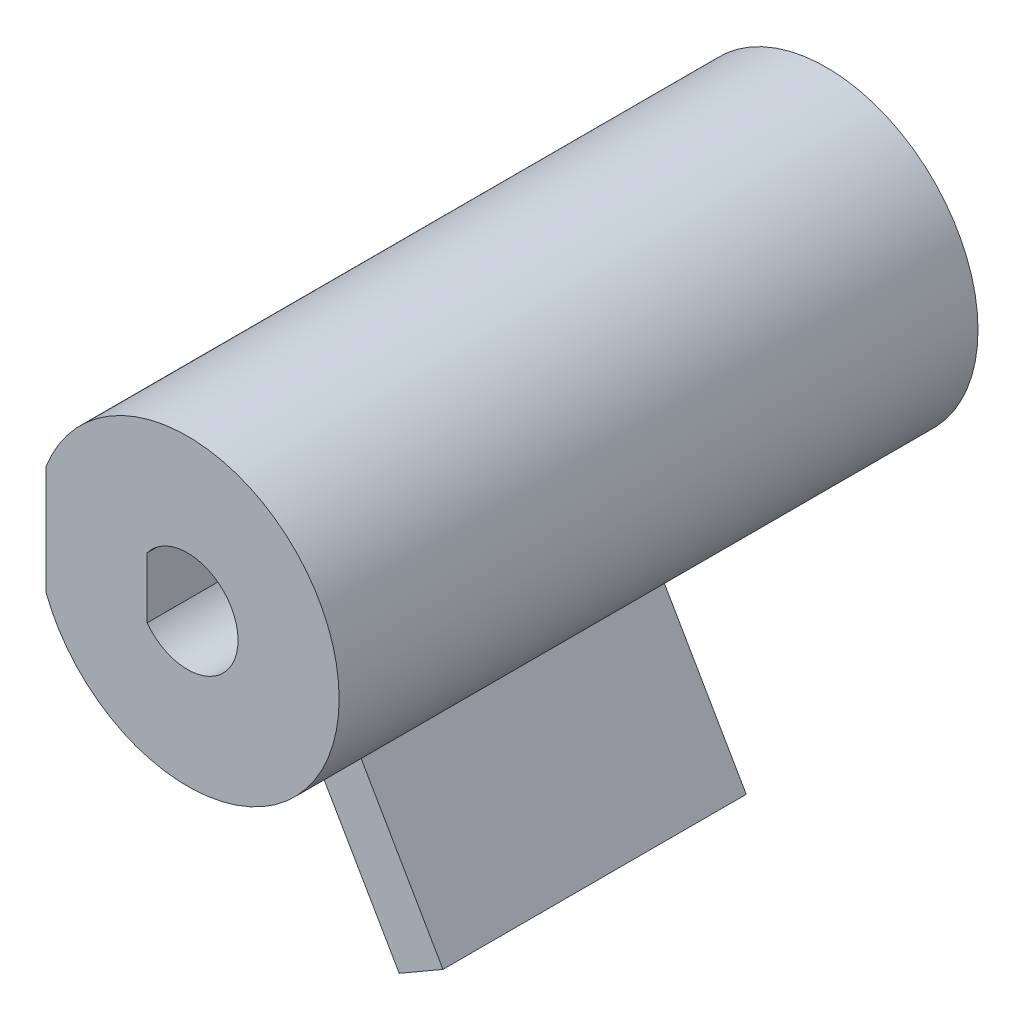
ISO-10303-21;
HEADER;
FILE_DESCRIPTION(('STEP AP214'),'2;1');
FILE_NAME('part.step','',(''),(''),'','','');
FILE_SCHEMA(('AUTOMOTIVE_DESIGN { 1 0 10303 214 1 1 1 1 }'));
ENDSEC;
DATA;
#1=APPLICATION_CONTEXT('core data for automotive mechanical design processes');
#2=APPLICATION_PROTOCOL_DEFINITION('international standard','automotive_design',2000,#1);
#3=PRODUCT_CONTEXT('',#1,'mechanical');
#4=PRODUCT('Part','Part','',(#3));
#5=PRODUCT_RELATED_PRODUCT_CATEGORY('part','',(#4));
#6=PRODUCT_DEFINITION_FORMATION('','',#4);
#7=PRODUCT_DEFINITION_CONTEXT('part definition',#1,'design');
#8=PRODUCT_DEFINITION('design','',#6,#7);
#9=PRODUCT_DEFINITION_SHAPE('','',#8);
#10=(LENGTH_UNIT() NAMED_UNIT(*) SI_UNIT(.MILLI.,.METRE.));
#11=(NAMED_UNIT(*) PLANE_ANGLE_UNIT() SI_UNIT($,.RADIAN.));
#12=(NAMED_UNIT(*) SI_UNIT($,.STERADIAN.) SOLID_ANGLE_UNIT());
#13=UNCERTAINTY_MEASURE_WITH_UNIT(LENGTH_MEASURE(1.E-05),#10,'distance_accuracy_value','');
#14=(GEOMETRIC_REPRESENTATION_CONTEXT(3) GLOBAL_UNCERTAINTY_ASSIGNED_CONTEXT((#13)) GLOBAL_UNIT_ASSIGNED_CONTEXT((#10,
#11,#12)) REPRESENTATION_CONTEXT('',''));
#15=CARTESIAN_POINT('',(0.,0.,0.));
#16=DIRECTION('',(0.,0.,1.));
#17=DIRECTION('',(1.,0.,0.));
#18=AXIS2_PLACEMENT_3D('',#15,#16,#17);
#19=CARTESIAN_POINT('',(0.,0.,63.2));
#20=DIRECTION('',(0.,0.,-1.));
#21=DIRECTION('',(-1.,0.,0.));
#22=AXIS2_PLACEMENT_3D('',#19,#20,#21);
#23=CYLINDRICAL_SURFACE('',#22,15.);
#24=CARTESIAN_POINT('',(0.,0.,0.));
#25=DIRECTION('',(0.,0.,1.));
#26=DIRECTION('',(1.,0.,0.));
#27=AXIS2_PLACEMENT_3D('',#24,#25,#26);
#28=CIRCLE('',#27,15.);
#29=CARTESIAN_POINT('',(-14.,-5.3851648071345,0.));
#30=VERTEX_POINT('',#29);
#31=CARTESIAN_POINT('',(-14.,5.3851648071345,0.));
#32=VERTEX_POINT('',#31);
#33=EDGE_CURVE('E164',#30,#32,#28,.T.);
#34=ORIENTED_EDGE('',*,*,#33,.T.);
#35=DIRECTION('',(0.,0.,-1.));
#36=VECTOR('',#35,1.);
#37=CARTESIAN_POINT('',(-14.,5.3851648071345,63.2));
#38=LINE('',#37,#36);
#39=CARTESIAN_POINT('',(-14.,5.3851648071345,63.2));
#40=VERTEX_POINT('',#39);
#41=EDGE_CURVE('E57',#40,#32,#38,.T.);
#42=ORIENTED_EDGE('',*,*,#41,.F.);
#43=CARTESIAN_POINT('',(0.,0.,63.2));
#44=DIRECTION('',(0.,0.,1.));
#45=DIRECTION('',(1.,0.,0.));
#46=AXIS2_PLACEMENT_3D('',#43,#44,#45);
#47=CIRCLE('',#46,15.);
#48=CARTESIAN_POINT('',(-14.,-5.3851648071345,63.2));
#49=VERTEX_POINT('',#48);
#50=EDGE_CURVE('E165',#49,#40,#47,.T.);
#51=ORIENTED_EDGE('',*,*,#50,.F.);
#52=DIRECTION('',(0.,0.,-1.));
#53=VECTOR('',#52,1.);
#54=CARTESIAN_POINT('',(-14.,-5.3851648071345,63.2));
#55=LINE('',#54,#53);
#56=EDGE_CURVE('E171',#49,#30,#55,.T.);
#57=ORIENTED_EDGE('',*,*,#56,.T.);
#58=EDGE_LOOP('',(#34,#42,#51,#57));
#59=FACE_BOUND('',#58,.T.);
#60=CARTESIAN_POINT('',(0.,0.,46.6));
#61=DIRECTION('',(0.,0.,-1.));
#62=DIRECTION('',(-1.,0.,0.));
#63=AXIS2_PLACEMENT_3D('',#60,#61,#62);
#64=CIRCLE('',#63,15.);
#65=CARTESIAN_POINT('',(-2.83100951711182,-14.7304237927502,46.6));
#66=VERTEX_POINT('',#65);
#67=CARTESIAN_POINT('',(-11.6636895265445,-9.43177324941475,46.6));
#68=VERTEX_POINT('',#67);
#69=EDGE_CURVE('E130',#66,#68,#64,.T.);
#70=ORIENTED_EDGE('',*,*,#69,.F.);
#71=DIRECTION('',(0.,0.,-1.));
#72=VECTOR('',#71,1.);
#73=CARTESIAN_POINT('',(-2.83100951711182,-14.7304237927502,63.2));
#74=LINE('',#73,#72);
#75=CARTESIAN_POINT('',(-2.83100951711182,-14.7304237927502,16.6));
#76=VERTEX_POINT('',#75);
#77=EDGE_CURVE('E12',#76,#66,#74,.F.);
#78=ORIENTED_EDGE('',*,*,#77,.F.);
#79=CARTESIAN_POINT('',(0.,0.,16.6));
#80=DIRECTION('',(0.,0.,-1.));
#81=DIRECTION('',(-1.,0.,0.));
#82=AXIS2_PLACEMENT_3D('',#79,#80,#81);
#83=CIRCLE('',#82,15.);
#84=CARTESIAN_POINT('',(-11.6636895265445,-9.43177324941475,16.6));
#85=VERTEX_POINT('',#84);
#86=EDGE_CURVE('E121',#76,#85,#83,.T.);
#87=ORIENTED_EDGE('',*,*,#86,.T.);
#88=DIRECTION('',(0.,0.,-1.));
#89=VECTOR('',#88,1.);
#90=CARTESIAN_POINT('',(-11.6636895265445,-9.43177324941474,63.2));
#91=LINE('',#90,#89);
#92=EDGE_CURVE('E148',#85,#68,#91,.F.);
#93=ORIENTED_EDGE('',*,*,#92,.T.);
#94=EDGE_LOOP('',(#70,#78,#87,#93));
#95=FACE_BOUND('',#94,.T.);
#96=ADVANCED_FACE('F50',(#59,#95),#23,.T.);
#97=CARTESIAN_POINT('',(0.,0.,63.2));
#98=DIRECTION('',(0.,0.,1.));
#99=DIRECTION('',(1.,0.,0.));
#100=AXIS2_PLACEMENT_3D('',#97,#98,#99);
#101=PLANE('',#100);
#102=ORIENTED_EDGE('',*,*,#50,.T.);
#103=DIRECTION('',(0.,-1.,0.));
#104=VECTOR('',#103,1.);
#105=CARTESIAN_POINT('',(-14.,3.,63.2));
#106=LINE('',#105,#104);
#107=EDGE_CURVE('E168',#40,#49,#106,.T.);
#108=ORIENTED_EDGE('',*,*,#107,.T.);
#109=EDGE_LOOP('',(#102,#108));
#110=FACE_BOUND('',#109,.T.);
#111=DIRECTION('',(0.,-1.,0.));
#112=VECTOR('',#111,1.);
#113=CARTESIAN_POINT('',(-4.,3.,63.2));
#114=LINE('',#113,#112);
#115=CARTESIAN_POINT('',(-4.,3.,63.2));
#116=VERTEX_POINT('',#115);
#117=CARTESIAN_POINT('',(-4.,-3.,63.2));
#118=VERTEX_POINT('',#117);
#119=EDGE_CURVE('E153',#116,#118,#114,.T.);
#120=ORIENTED_EDGE('',*,*,#119,.F.);
#121=CARTESIAN_POINT('',(0.,0.,63.2));
#122=DIRECTION('',(0.,0.,1.));
#123=DIRECTION('',(1.,0.,0.));
#124=AXIS2_PLACEMENT_3D('',#121,#122,#123);
#125=CIRCLE('',#124,5.);
#126=EDGE_CURVE('E151',#118,#116,#125,.T.);
#127=ORIENTED_EDGE('',*,*,#126,.F.);
#128=EDGE_LOOP('',(#120,#127));
#129=FACE_BOUND('',#128,.T.);
#130=ADVANCED_FACE('F189',(#110,#129),#101,.T.);
#131=CARTESIAN_POINT('',(0.,0.,0.));
#132=DIRECTION('',(0.,0.,1.));
#133=DIRECTION('',(1.,0.,0.));
#134=AXIS2_PLACEMENT_3D('',#131,#132,#133);
#135=PLANE('',#134);
#136=ORIENTED_EDGE('',*,*,#33,.F.);
#137=DIRECTION('',(0.,-1.,0.));
#138=VECTOR('',#137,1.);
#139=CARTESIAN_POINT('',(-14.,3.,0.));
#140=LINE('',#139,#138);
#141=EDGE_CURVE('E169',#32,#30,#140,.T.);
#142=ORIENTED_EDGE('',*,*,#141,.F.);
#143=EDGE_LOOP('',(#136,#142));
#144=FACE_BOUND('',#143,.T.);
#145=CARTESIAN_POINT('',(0.,0.,0.));
#146=DIRECTION('',(0.,0.,1.));
#147=DIRECTION('',(1.,0.,0.));
#148=AXIS2_PLACEMENT_3D('',#145,#146,#147);
#149=CIRCLE('',#148,5.);
#150=CARTESIAN_POINT('',(-4.,-3.,0.));
#151=VERTEX_POINT('',#150);
#152=CARTESIAN_POINT('',(-4.,3.,0.));
#153=VERTEX_POINT('',#152);
#154=EDGE_CURVE('E150',#151,#153,#149,.T.);
#155=ORIENTED_EDGE('',*,*,#154,.T.);
#156=DIRECTION('',(0.,-1.,0.));
#157=VECTOR('',#156,1.);
#158=CARTESIAN_POINT('',(-4.,3.,0.));
#159=LINE('',#158,#157);
#160=EDGE_CURVE('E154',#153,#151,#159,.T.);
#161=ORIENTED_EDGE('',*,*,#160,.T.);
#162=EDGE_LOOP('',(#155,#161));
#163=FACE_BOUND('',#162,.T.);
#164=ADVANCED_FACE('F185',(#144,#163),#135,.F.);
#165=CARTESIAN_POINT('',(-14.,3.,63.2));
#166=DIRECTION('',(1.,0.,0.));
#167=DIRECTION('',(0.,0.,-1.));
#168=AXIS2_PLACEMENT_3D('',#165,#166,#167);
#169=PLANE('',#168);
#170=ORIENTED_EDGE('',*,*,#141,.T.);
#171=ORIENTED_EDGE('',*,*,#56,.F.);
#172=ORIENTED_EDGE('',*,*,#107,.F.);
#173=ORIENTED_EDGE('',*,*,#41,.T.);
#174=EDGE_LOOP('',(#170,#171,#172,#173));
#175=FACE_BOUND('',#174,.T.);
#176=ADVANCED_FACE('F179',(#175),#169,.F.);
#177=CARTESIAN_POINT('',(0.,0.,63.2));
#178=DIRECTION('',(0.,0.,-1.));
#179=DIRECTION('',(-1.,0.,0.));
#180=AXIS2_PLACEMENT_3D('',#177,#178,#179);
#181=CYLINDRICAL_SURFACE('',#180,5.);
#182=ORIENTED_EDGE('',*,*,#154,.F.);
#183=DIRECTION('',(0.,0.,-1.));
#184=VECTOR('',#183,1.);
#185=CARTESIAN_POINT('',(-4.,-3.,63.2));
#186=LINE('',#185,#184);
#187=EDGE_CURVE('E156',#118,#151,#186,.T.);
#188=ORIENTED_EDGE('',*,*,#187,.F.);
#189=ORIENTED_EDGE('',*,*,#126,.T.);
#190=DIRECTION('',(0.,0.,-1.));
#191=VECTOR('',#190,1.);
#192=CARTESIAN_POINT('',(-4.,3.,63.2));
#193=LINE('',#192,#191);
#194=EDGE_CURVE('E72',#116,#153,#193,.T.);
#195=ORIENTED_EDGE('',*,*,#194,.T.);
#196=EDGE_LOOP('',(#182,#188,#189,#195));
#197=FACE_BOUND('',#196,.T.);
#198=ADVANCED_FACE('F198',(#197),#181,.F.);
#199=CARTESIAN_POINT('',(-4.,3.,63.2));
#200=DIRECTION('',(1.,0.,0.));
#201=DIRECTION('',(0.,0.,-1.));
#202=AXIS2_PLACEMENT_3D('',#199,#200,#201);
#203=PLANE('',#202);
#204=ORIENTED_EDGE('',*,*,#160,.F.);
#205=ORIENTED_EDGE('',*,*,#194,.F.);
#206=ORIENTED_EDGE('',*,*,#119,.T.);
#207=ORIENTED_EDGE('',*,*,#187,.T.);
#208=EDGE_LOOP('',(#204,#205,#206,#207));
#209=FACE_BOUND('',#208,.T.);
#210=ADVANCED_FACE('F196',(#209),#203,.T.);
#211=CARTESIAN_POINT('',(-9.66987298107779,-2.88516480713453,46.6));
#212=DIRECTION('',(-0.866025403784442,-0.499999999999995,0.));
#213=DIRECTION('',(0.499999999999995,-0.866025403784442,0.));
#214=AXIS2_PLACEMENT_3D('',#211,#212,#213);
#215=PLANE('',#214);
#216=DIRECTION('',(-0.499999999999995,0.866025403784442,0.));
#217=VECTOR('',#216,1.);
#218=CARTESIAN_POINT('',(-9.66987298107779,-2.88516480713453,16.6));
#219=LINE('',#218,#217);
#220=CARTESIAN_POINT('',(8.67176721066543,-34.6538175133816,16.6));
#221=VERTEX_POINT('',#220);
#222=EDGE_CURVE('E131',#221,#76,#219,.T.);
#223=ORIENTED_EDGE('',*,*,#222,.T.);
#224=ORIENTED_EDGE('',*,*,#77,.T.);
#225=DIRECTION('',(-0.499999999999995,0.866025403784442,0.));
#226=VECTOR('',#225,1.);
#227=CARTESIAN_POINT('',(-9.66987298107779,-2.88516480713453,46.6));
#228=LINE('',#227,#226);
#229=CARTESIAN_POINT('',(8.67176721066543,-34.6538175133816,46.6));
#230=VERTEX_POINT('',#229);
#231=EDGE_CURVE('E135',#230,#66,#228,.T.);
#232=ORIENTED_EDGE('',*,*,#231,.F.);
#233=DIRECTION('',(0.,0.,-1.));
#234=VECTOR('',#233,1.);
#235=CARTESIAN_POINT('',(8.67176721066543,-34.6538175133816,46.6));
#236=LINE('',#235,#234);
#237=EDGE_CURVE('E122',#230,#221,#236,.T.);
#238=ORIENTED_EDGE('',*,*,#237,.T.);
#239=EDGE_LOOP('',(#223,#224,#232,#238));
#240=FACE_BOUND('',#239,.T.);
#241=ADVANCED_FACE('F236',(#240),#215,.F.);
#242=CARTESIAN_POINT('',(-14.,-5.3851648071345,46.6));
#243=DIRECTION('',(-0.866025403784442,-0.499999999999995,0.));
#244=DIRECTION('',(0.499999999999995,-0.866025403784442,0.));
#245=AXIS2_PLACEMENT_3D('',#242,#243,#244);
#246=PLANE('',#245);
#247=ORIENTED_EDGE('',*,*,#92,.F.);
#248=DIRECTION('',(-0.499999999999995,0.866025403784442,0.));
#249=VECTOR('',#248,1.);
#250=CARTESIAN_POINT('',(-14.,-5.3851648071345,16.6));
#251=LINE('',#250,#249);
#252=CARTESIAN_POINT('',(4.34164019174322,-37.1538175133816,16.6));
#253=VERTEX_POINT('',#252);
#254=EDGE_CURVE('E64',#253,#85,#251,.T.);
#255=ORIENTED_EDGE('',*,*,#254,.F.);
#256=DIRECTION('',(0.,0.,-1.));
#257=VECTOR('',#256,1.);
#258=CARTESIAN_POINT('',(4.34164019174322,-37.1538175133816,46.6));
#259=LINE('',#258,#257);
#260=CARTESIAN_POINT('',(4.34164019174322,-37.1538175133816,46.6));
#261=VERTEX_POINT('',#260);
#262=EDGE_CURVE('E113',#261,#253,#259,.T.);
#263=ORIENTED_EDGE('',*,*,#262,.F.);
#264=DIRECTION('',(-0.499999999999995,0.866025403784442,0.));
#265=VECTOR('',#264,1.);
#266=CARTESIAN_POINT('',(-14.,-5.3851648071345,46.6));
#267=LINE('',#266,#265);
#268=EDGE_CURVE('E116',#261,#68,#267,.T.);
#269=ORIENTED_EDGE('',*,*,#268,.T.);
#270=EDGE_LOOP('',(#247,#255,#263,#269));
#271=FACE_BOUND('',#270,.T.);
#272=ADVANCED_FACE('F115',(#271),#246,.T.);
#273=CARTESIAN_POINT('',(0.,0.,46.6));
#274=DIRECTION('',(0.,0.,-1.));
#275=DIRECTION('',(-1.,0.,0.));
#276=AXIS2_PLACEMENT_3D('',#273,#274,#275);
#277=PLANE('',#276);
#278=ORIENTED_EDGE('',*,*,#231,.T.);
#279=ORIENTED_EDGE('',*,*,#69,.T.);
#280=ORIENTED_EDGE('',*,*,#268,.F.);
#281=DIRECTION('',(-0.866025403784442,-0.499999999999995,0.));
#282=VECTOR('',#281,1.);
#283=CARTESIAN_POINT('',(8.67176721066543,-34.6538175133816,46.6));
#284=LINE('',#283,#282);
#285=EDGE_CURVE('E128',#230,#261,#284,.T.);
#286=ORIENTED_EDGE('',*,*,#285,.F.);
#287=EDGE_LOOP('',(#278,#279,#280,#286));
#288=FACE_BOUND('',#287,.T.);
#289=ADVANCED_FACE('F127',(#288),#277,.F.);
#290=CARTESIAN_POINT('',(0.,0.,16.6));
#291=DIRECTION('',(0.,0.,-1.));
#292=DIRECTION('',(-1.,0.,0.));
#293=AXIS2_PLACEMENT_3D('',#290,#291,#292);
#294=PLANE('',#293);
#295=ORIENTED_EDGE('',*,*,#86,.F.);
#296=ORIENTED_EDGE('',*,*,#222,.F.);
#297=DIRECTION('',(-0.866025403784442,-0.499999999999995,0.));
#298=VECTOR('',#297,1.);
#299=CARTESIAN_POINT('',(8.67176721066543,-34.6538175133816,16.6));
#300=LINE('',#299,#298);
#301=EDGE_CURVE('E140',#221,#253,#300,.T.);
#302=ORIENTED_EDGE('',*,*,#301,.T.);
#303=ORIENTED_EDGE('',*,*,#254,.T.);
#304=EDGE_LOOP('',(#295,#296,#302,#303));
#305=FACE_BOUND('',#304,.T.);
#306=ADVANCED_FACE('F260',(#305),#294,.T.);
#307=CARTESIAN_POINT('',(8.67176721066543,-34.6538175133816,46.6));
#308=DIRECTION('',(0.499999999999995,-0.866025403784442,0.));
#309=DIRECTION('',(0.866025403784442,0.499999999999995,0.));
#310=AXIS2_PLACEMENT_3D('',#307,#308,#309);
#311=PLANE('',#310);
#312=ORIENTED_EDGE('',*,*,#301,.F.);
#313=ORIENTED_EDGE('',*,*,#237,.F.);
#314=ORIENTED_EDGE('',*,*,#285,.T.);
#315=ORIENTED_EDGE('',*,*,#262,.T.);
#316=EDGE_LOOP('',(#312,#313,#314,#315));
#317=FACE_BOUND('',#316,.T.);
#318=ADVANCED_FACE('F133',(#317),#311,.T.);
#319=CLOSED_SHELL('',(#96,#130,#164,#176,#198,#210,#241,#272,#289,#306,#318));
#320=MANIFOLD_SOLID_BREP('B2',#319);
#321=ADVANCED_BREP_SHAPE_REPRESENTATION('',(#18,#320),#14);
#322=SHAPE_DEFINITION_REPRESENTATION(#9,#321);
ENDSEC;
END-ISO-10303-21;
